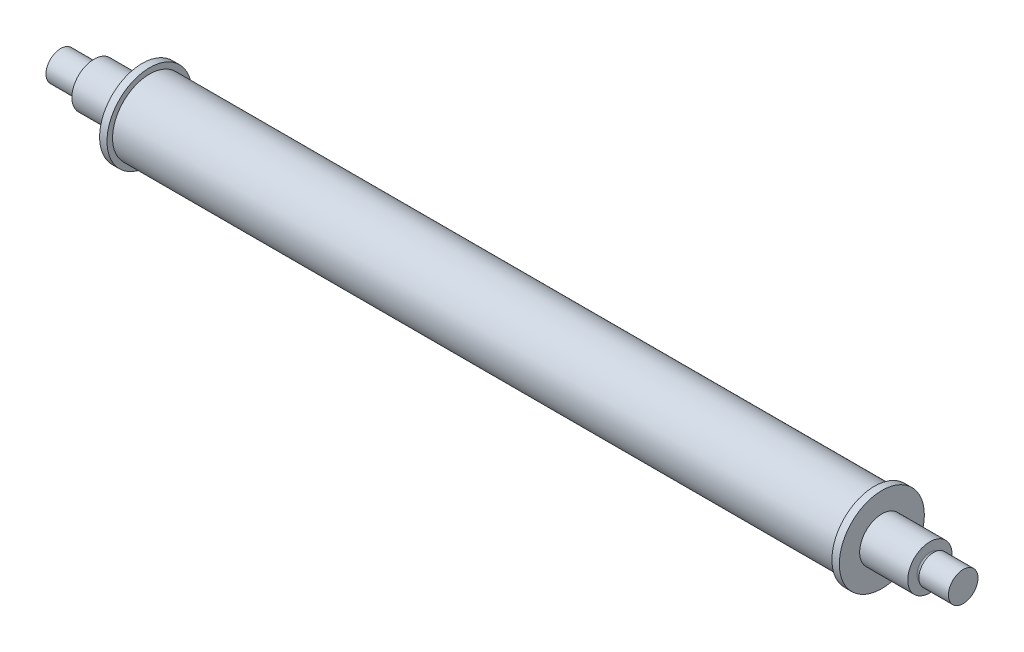
ISO-10303-21;
HEADER;
FILE_DESCRIPTION(('STEP AP214'),'2;1');
FILE_NAME('part.step','',(''),(''),'','','');
FILE_SCHEMA(('AUTOMOTIVE_DESIGN { 1 0 10303 214 1 1 1 1 }'));
ENDSEC;
DATA;
#1=APPLICATION_CONTEXT('core data for automotive mechanical design processes');
#2=APPLICATION_PROTOCOL_DEFINITION('international standard','automotive_design',2000,#1);
#3=PRODUCT_CONTEXT('',#1,'mechanical');
#4=PRODUCT('Part','Part','',(#3));
#5=PRODUCT_RELATED_PRODUCT_CATEGORY('part','',(#4));
#6=PRODUCT_DEFINITION_FORMATION('','',#4);
#7=PRODUCT_DEFINITION_CONTEXT('part definition',#1,'design');
#8=PRODUCT_DEFINITION('design','',#6,#7);
#9=PRODUCT_DEFINITION_SHAPE('','',#8);
#10=(LENGTH_UNIT() NAMED_UNIT(*) SI_UNIT(.MILLI.,.METRE.));
#11=(NAMED_UNIT(*) PLANE_ANGLE_UNIT() SI_UNIT($,.RADIAN.));
#12=(NAMED_UNIT(*) SI_UNIT($,.STERADIAN.) SOLID_ANGLE_UNIT());
#13=UNCERTAINTY_MEASURE_WITH_UNIT(LENGTH_MEASURE(1.E-05),#10,'distance_accuracy_value','');
#14=(GEOMETRIC_REPRESENTATION_CONTEXT(3) GLOBAL_UNCERTAINTY_ASSIGNED_CONTEXT((#13)) GLOBAL_UNIT_ASSIGNED_CONTEXT((#10,
#11,#12)) REPRESENTATION_CONTEXT('',''));
#15=CARTESIAN_POINT('',(0.,0.,0.));
#16=DIRECTION('',(0.,0.,1.));
#17=DIRECTION('',(1.,0.,0.));
#18=AXIS2_PLACEMENT_3D('',#15,#16,#17);
#19=CARTESIAN_POINT('',(-75.0769230769231,0.,0.));
#20=DIRECTION('',(1.,0.,0.));
#21=DIRECTION('',(0.,0.,-1.));
#22=AXIS2_PLACEMENT_3D('',#19,#20,#21);
#23=CYLINDRICAL_SURFACE('',#22,2.46153846153846);
#24=CARTESIAN_POINT('',(-75.0769230769231,0.,0.));
#25=DIRECTION('',(1.,0.,0.));
#26=DIRECTION('',(0.,0.,-1.));
#27=AXIS2_PLACEMENT_3D('',#24,#25,#26);
#28=CIRCLE('',#27,2.46153846153846);
#29=CARTESIAN_POINT('',(-75.0769230769231,0.,-2.46153846153846));
#30=VERTEX_POINT('',#29);
#31=EDGE_CURVE('E93',#30,#30,#28,.T.);
#32=ORIENTED_EDGE('',*,*,#31,.T.);
#33=EDGE_LOOP('',(#32));
#34=FACE_BOUND('',#33,.T.);
#35=CARTESIAN_POINT('',(-70.1538461538462,0.,0.));
#36=DIRECTION('',(1.,0.,0.));
#37=DIRECTION('',(0.,0.,-1.));
#38=AXIS2_PLACEMENT_3D('',#35,#36,#37);
#39=CIRCLE('',#38,2.46153846153846);
#40=CARTESIAN_POINT('',(-70.1538461538462,0.,-2.46153846153846));
#41=VERTEX_POINT('',#40);
#42=EDGE_CURVE('E10',#41,#41,#39,.T.);
#43=ORIENTED_EDGE('',*,*,#42,.F.);
#44=EDGE_LOOP('',(#43));
#45=FACE_BOUND('',#44,.T.);
#46=ADVANCED_FACE('F35',(#34,#45),#23,.T.);
#47=CARTESIAN_POINT('',(-70.1538461538462,2.15384615384615,0.));
#48=DIRECTION('',(1.,0.,0.));
#49=DIRECTION('',(0.,0.,-1.));
#50=AXIS2_PLACEMENT_3D('',#47,#48,#49);
#51=PLANE('',#50);
#52=ORIENTED_EDGE('',*,*,#42,.T.);
#53=EDGE_LOOP('',(#52));
#54=FACE_BOUND('',#53,.T.);
#55=CARTESIAN_POINT('',(-70.1538461538462,0.,0.));
#56=DIRECTION('',(1.,0.,0.));
#57=DIRECTION('',(0.,0.,-1.));
#58=AXIS2_PLACEMENT_3D('',#55,#56,#57);
#59=CIRCLE('',#58,2.15384615384615);
#60=CARTESIAN_POINT('',(-70.1538461538462,0.,-2.15384615384615));
#61=VERTEX_POINT('',#60);
#62=EDGE_CURVE('E41',#61,#61,#59,.T.);
#63=ORIENTED_EDGE('',*,*,#62,.F.);
#64=EDGE_LOOP('',(#63));
#65=FACE_BOUND('',#64,.T.);
#66=ADVANCED_FACE('F110',(#54,#65),#51,.T.);
#67=CARTESIAN_POINT('',(-69.8461538461539,0.,0.));
#68=DIRECTION('',(1.,0.,0.));
#69=DIRECTION('',(0.,0.,-1.));
#70=AXIS2_PLACEMENT_3D('',#67,#68,#69);
#71=TOROIDAL_SURFACE('',#70,2.15384615384615,0.307692307692307);
#72=ORIENTED_EDGE('',*,*,#62,.T.);
#73=EDGE_LOOP('',(#72));
#74=FACE_BOUND('',#73,.T.);
#75=CARTESIAN_POINT('',(-69.5384615384616,0.,0.));
#76=DIRECTION('',(1.,0.,0.));
#77=DIRECTION('',(0.,0.,-1.));
#78=AXIS2_PLACEMENT_3D('',#75,#76,#77);
#79=CIRCLE('',#78,2.15384615384615);
#80=CARTESIAN_POINT('',(-69.5384615384616,0.,-2.15384615384615));
#81=VERTEX_POINT('',#80);
#82=EDGE_CURVE('E45',#81,#81,#79,.T.);
#83=ORIENTED_EDGE('',*,*,#82,.F.);
#84=EDGE_LOOP('',(#83));
#85=FACE_BOUND('',#84,.T.);
#86=ADVANCED_FACE('F114',(#74,#85),#71,.F.);
#87=CARTESIAN_POINT('',(-69.5384615384616,3.69230769230769,0.));
#88=DIRECTION('',(-1.,0.,0.));
#89=DIRECTION('',(0.,0.,1.));
#90=AXIS2_PLACEMENT_3D('',#87,#88,#89);
#91=PLANE('',#90);
#92=ORIENTED_EDGE('',*,*,#82,.T.);
#93=EDGE_LOOP('',(#92));
#94=FACE_BOUND('',#93,.T.);
#95=CARTESIAN_POINT('',(-69.5384615384616,0.,0.));
#96=DIRECTION('',(1.,0.,0.));
#97=DIRECTION('',(0.,0.,-1.));
#98=AXIS2_PLACEMENT_3D('',#95,#96,#97);
#99=CIRCLE('',#98,3.69230769230769);
#100=CARTESIAN_POINT('',(-69.5384615384616,0.,-3.69230769230769));
#101=VERTEX_POINT('',#100);
#102=EDGE_CURVE('E49',#101,#101,#99,.T.);
#103=ORIENTED_EDGE('',*,*,#102,.F.);
#104=EDGE_LOOP('',(#103));
#105=FACE_BOUND('',#104,.T.);
#106=ADVANCED_FACE('F118',(#94,#105),#91,.T.);
#107=CARTESIAN_POINT('',(-75.0769230769231,0.,0.));
#108=DIRECTION('',(1.,0.,0.));
#109=DIRECTION('',(0.,0.,-1.));
#110=AXIS2_PLACEMENT_3D('',#107,#108,#109);
#111=CYLINDRICAL_SURFACE('',#110,3.69230769230769);
#112=ORIENTED_EDGE('',*,*,#102,.T.);
#113=EDGE_LOOP('',(#112));
#114=FACE_BOUND('',#113,.T.);
#115=CARTESIAN_POINT('',(-61.5384615384616,0.,0.));
#116=DIRECTION('',(1.,0.,0.));
#117=DIRECTION('',(0.,0.,-1.));
#118=AXIS2_PLACEMENT_3D('',#115,#116,#117);
#119=CIRCLE('',#118,3.69230769230769);
#120=CARTESIAN_POINT('',(-61.5384615384616,0.,-3.69230769230769));
#121=VERTEX_POINT('',#120);
#122=EDGE_CURVE('E54',#121,#121,#119,.T.);
#123=ORIENTED_EDGE('',*,*,#122,.F.);
#124=EDGE_LOOP('',(#123));
#125=FACE_BOUND('',#124,.T.);
#126=ADVANCED_FACE('F124',(#114,#125),#111,.T.);
#127=CARTESIAN_POINT('',(-61.5384615384616,7.07692307692308,0.));
#128=DIRECTION('',(-1.,0.,0.));
#129=DIRECTION('',(0.,0.,1.));
#130=AXIS2_PLACEMENT_3D('',#127,#128,#129);
#131=PLANE('',#130);
#132=ORIENTED_EDGE('',*,*,#122,.T.);
#133=EDGE_LOOP('',(#132));
#134=FACE_BOUND('',#133,.T.);
#135=CARTESIAN_POINT('',(-61.5384615384616,0.,0.));
#136=DIRECTION('',(1.,0.,0.));
#137=DIRECTION('',(0.,0.,-1.));
#138=AXIS2_PLACEMENT_3D('',#135,#136,#137);
#139=CIRCLE('',#138,7.07692307692308);
#140=CARTESIAN_POINT('',(-61.5384615384616,0.,-7.07692307692308));
#141=VERTEX_POINT('',#140);
#142=EDGE_CURVE('E57',#141,#141,#139,.T.);
#143=ORIENTED_EDGE('',*,*,#142,.F.);
#144=EDGE_LOOP('',(#143));
#145=FACE_BOUND('',#144,.T.);
#146=ADVANCED_FACE('F128',(#134,#145),#131,.T.);
#147=CARTESIAN_POINT('',(-75.0769230769231,0.,0.));
#148=DIRECTION('',(1.,0.,0.));
#149=DIRECTION('',(0.,0.,-1.));
#150=AXIS2_PLACEMENT_3D('',#147,#148,#149);
#151=CYLINDRICAL_SURFACE('',#150,7.07692307692308);
#152=ORIENTED_EDGE('',*,*,#142,.T.);
#153=EDGE_LOOP('',(#152));
#154=FACE_BOUND('',#153,.T.);
#155=CARTESIAN_POINT('',(-60.3076923076923,0.,0.));
#156=DIRECTION('',(1.,0.,0.));
#157=DIRECTION('',(0.,0.,-1.));
#158=AXIS2_PLACEMENT_3D('',#155,#156,#157);
#159=CIRCLE('',#158,7.07692307692308);
#160=CARTESIAN_POINT('',(-60.3076923076923,0.,-7.07692307692308));
#161=VERTEX_POINT('',#160);
#162=EDGE_CURVE('E60',#161,#161,#159,.T.);
#163=ORIENTED_EDGE('',*,*,#162,.F.);
#164=EDGE_LOOP('',(#163));
#165=FACE_BOUND('',#164,.T.);
#166=ADVANCED_FACE('F132',(#154,#165),#151,.T.);
#167=CARTESIAN_POINT('',(-60.3076923076923,6.15384615384616,0.));
#168=DIRECTION('',(1.,0.,0.));
#169=DIRECTION('',(0.,0.,-1.));
#170=AXIS2_PLACEMENT_3D('',#167,#168,#169);
#171=PLANE('',#170);
#172=ORIENTED_EDGE('',*,*,#162,.T.);
#173=EDGE_LOOP('',(#172));
#174=FACE_BOUND('',#173,.T.);
#175=CARTESIAN_POINT('',(-60.3076923076923,0.,0.));
#176=DIRECTION('',(1.,0.,0.));
#177=DIRECTION('',(0.,0.,-1.));
#178=AXIS2_PLACEMENT_3D('',#175,#176,#177);
#179=CIRCLE('',#178,6.15384615384616);
#180=CARTESIAN_POINT('',(-60.3076923076923,0.,-6.15384615384616));
#181=VERTEX_POINT('',#180);
#182=EDGE_CURVE('E63',#181,#181,#179,.T.);
#183=ORIENTED_EDGE('',*,*,#182,.F.);
#184=EDGE_LOOP('',(#183));
#185=FACE_BOUND('',#184,.T.);
#186=ADVANCED_FACE('F136',(#174,#185),#171,.T.);
#187=CARTESIAN_POINT('',(-75.0769230769231,0.,0.));
#188=DIRECTION('',(1.,0.,0.));
#189=DIRECTION('',(0.,0.,-1.));
#190=AXIS2_PLACEMENT_3D('',#187,#188,#189);
#191=CYLINDRICAL_SURFACE('',#190,6.15384615384616);
#192=ORIENTED_EDGE('',*,*,#182,.T.);
#193=EDGE_LOOP('',(#192));
#194=FACE_BOUND('',#193,.T.);
#195=CARTESIAN_POINT('',(60.3076923076923,0.,0.));
#196=DIRECTION('',(1.,0.,0.));
#197=DIRECTION('',(0.,0.,-1.));
#198=AXIS2_PLACEMENT_3D('',#195,#196,#197);
#199=CIRCLE('',#198,6.15384615384616);
#200=CARTESIAN_POINT('',(60.3076923076923,0.,-6.15384615384616));
#201=VERTEX_POINT('',#200);
#202=EDGE_CURVE('E66',#201,#201,#199,.T.);
#203=ORIENTED_EDGE('',*,*,#202,.F.);
#204=EDGE_LOOP('',(#203));
#205=FACE_BOUND('',#204,.T.);
#206=ADVANCED_FACE('F140',(#194,#205),#191,.T.);
#207=CARTESIAN_POINT('',(60.3076923076923,7.07692307692308,0.));
#208=DIRECTION('',(-1.,0.,0.));
#209=DIRECTION('',(0.,0.,1.));
#210=AXIS2_PLACEMENT_3D('',#207,#208,#209);
#211=PLANE('',#210);
#212=ORIENTED_EDGE('',*,*,#202,.T.);
#213=EDGE_LOOP('',(#212));
#214=FACE_BOUND('',#213,.T.);
#215=CARTESIAN_POINT('',(60.3076923076923,0.,0.));
#216=DIRECTION('',(1.,0.,0.));
#217=DIRECTION('',(0.,0.,-1.));
#218=AXIS2_PLACEMENT_3D('',#215,#216,#217);
#219=CIRCLE('',#218,7.07692307692308);
#220=CARTESIAN_POINT('',(60.3076923076923,0.,-7.07692307692308));
#221=VERTEX_POINT('',#220);
#222=EDGE_CURVE('E69',#221,#221,#219,.T.);
#223=ORIENTED_EDGE('',*,*,#222,.F.);
#224=EDGE_LOOP('',(#223));
#225=FACE_BOUND('',#224,.T.);
#226=ADVANCED_FACE('F144',(#214,#225),#211,.T.);
#227=CARTESIAN_POINT('',(-75.0769230769231,0.,0.));
#228=DIRECTION('',(1.,0.,0.));
#229=DIRECTION('',(0.,0.,-1.));
#230=AXIS2_PLACEMENT_3D('',#227,#228,#229);
#231=CYLINDRICAL_SURFACE('',#230,7.07692307692308);
#232=ORIENTED_EDGE('',*,*,#222,.T.);
#233=EDGE_LOOP('',(#232));
#234=FACE_BOUND('',#233,.T.);
#235=CARTESIAN_POINT('',(61.5384615384615,0.,0.));
#236=DIRECTION('',(1.,0.,0.));
#237=DIRECTION('',(0.,0.,-1.));
#238=AXIS2_PLACEMENT_3D('',#235,#236,#237);
#239=CIRCLE('',#238,7.07692307692308);
#240=CARTESIAN_POINT('',(61.5384615384615,0.,-7.07692307692308));
#241=VERTEX_POINT('',#240);
#242=EDGE_CURVE('E72',#241,#241,#239,.T.);
#243=ORIENTED_EDGE('',*,*,#242,.F.);
#244=EDGE_LOOP('',(#243));
#245=FACE_BOUND('',#244,.T.);
#246=ADVANCED_FACE('F148',(#234,#245),#231,.T.);
#247=CARTESIAN_POINT('',(61.5384615384616,3.69230769230769,0.));
#248=DIRECTION('',(1.,0.,0.));
#249=DIRECTION('',(0.,0.,-1.));
#250=AXIS2_PLACEMENT_3D('',#247,#248,#249);
#251=PLANE('',#250);
#252=ORIENTED_EDGE('',*,*,#242,.T.);
#253=EDGE_LOOP('',(#252));
#254=FACE_BOUND('',#253,.T.);
#255=CARTESIAN_POINT('',(61.5384615384615,0.,0.));
#256=DIRECTION('',(1.,0.,0.));
#257=DIRECTION('',(0.,0.,-1.));
#258=AXIS2_PLACEMENT_3D('',#255,#256,#257);
#259=CIRCLE('',#258,3.69230769230769);
#260=CARTESIAN_POINT('',(61.5384615384615,0.,-3.69230769230769));
#261=VERTEX_POINT('',#260);
#262=EDGE_CURVE('E75',#261,#261,#259,.T.);
#263=ORIENTED_EDGE('',*,*,#262,.F.);
#264=EDGE_LOOP('',(#263));
#265=FACE_BOUND('',#264,.T.);
#266=ADVANCED_FACE('F152',(#254,#265),#251,.T.);
#267=CARTESIAN_POINT('',(-75.0769230769231,0.,0.));
#268=DIRECTION('',(1.,0.,0.));
#269=DIRECTION('',(0.,0.,-1.));
#270=AXIS2_PLACEMENT_3D('',#267,#268,#269);
#271=CYLINDRICAL_SURFACE('',#270,3.69230769230769);
#272=ORIENTED_EDGE('',*,*,#262,.T.);
#273=EDGE_LOOP('',(#272));
#274=FACE_BOUND('',#273,.T.);
#275=CARTESIAN_POINT('',(69.5384615384615,0.,0.));
#276=DIRECTION('',(1.,0.,0.));
#277=DIRECTION('',(0.,0.,-1.));
#278=AXIS2_PLACEMENT_3D('',#275,#276,#277);
#279=CIRCLE('',#278,3.69230769230769);
#280=CARTESIAN_POINT('',(69.5384615384615,0.,-3.69230769230769));
#281=VERTEX_POINT('',#280);
#282=EDGE_CURVE('E78',#281,#281,#279,.T.);
#283=ORIENTED_EDGE('',*,*,#282,.F.);
#284=EDGE_LOOP('',(#283));
#285=FACE_BOUND('',#284,.T.);
#286=ADVANCED_FACE('F156',(#274,#285),#271,.T.);
#287=CARTESIAN_POINT('',(69.5384615384615,2.15384615384615,0.));
#288=DIRECTION('',(1.,0.,0.));
#289=DIRECTION('',(0.,0.,-1.));
#290=AXIS2_PLACEMENT_3D('',#287,#288,#289);
#291=PLANE('',#290);
#292=ORIENTED_EDGE('',*,*,#282,.T.);
#293=EDGE_LOOP('',(#292));
#294=FACE_BOUND('',#293,.T.);
#295=CARTESIAN_POINT('',(69.5384615384615,0.,0.));
#296=DIRECTION('',(1.,0.,0.));
#297=DIRECTION('',(0.,0.,-1.));
#298=AXIS2_PLACEMENT_3D('',#295,#296,#297);
#299=CIRCLE('',#298,2.15384615384615);
#300=CARTESIAN_POINT('',(69.5384615384615,0.,-2.15384615384615));
#301=VERTEX_POINT('',#300);
#302=EDGE_CURVE('E81',#301,#301,#299,.T.);
#303=ORIENTED_EDGE('',*,*,#302,.F.);
#304=EDGE_LOOP('',(#303));
#305=FACE_BOUND('',#304,.T.);
#306=ADVANCED_FACE('F160',(#294,#305),#291,.T.);
#307=CARTESIAN_POINT('',(69.8461538461539,0.,0.));
#308=DIRECTION('',(1.,0.,0.));
#309=DIRECTION('',(0.,0.,-1.));
#310=AXIS2_PLACEMENT_3D('',#307,#308,#309);
#311=TOROIDAL_SURFACE('',#310,2.15384615384615,0.307692307692307);
#312=ORIENTED_EDGE('',*,*,#302,.T.);
#313=EDGE_LOOP('',(#312));
#314=FACE_BOUND('',#313,.T.);
#315=CARTESIAN_POINT('',(70.1538461538462,0.,0.));
#316=DIRECTION('',(1.,0.,0.));
#317=DIRECTION('',(0.,0.,-1.));
#318=AXIS2_PLACEMENT_3D('',#315,#316,#317);
#319=CIRCLE('',#318,2.15384615384615);
#320=CARTESIAN_POINT('',(70.1538461538462,0.,-2.15384615384615));
#321=VERTEX_POINT('',#320);
#322=EDGE_CURVE('E84',#321,#321,#319,.T.);
#323=ORIENTED_EDGE('',*,*,#322,.F.);
#324=EDGE_LOOP('',(#323));
#325=FACE_BOUND('',#324,.T.);
#326=ADVANCED_FACE('F164',(#314,#325),#311,.F.);
#327=CARTESIAN_POINT('',(70.1538461538462,2.46153846153846,0.));
#328=DIRECTION('',(-1.,0.,0.));
#329=DIRECTION('',(0.,0.,1.));
#330=AXIS2_PLACEMENT_3D('',#327,#328,#329);
#331=PLANE('',#330);
#332=ORIENTED_EDGE('',*,*,#322,.T.);
#333=EDGE_LOOP('',(#332));
#334=FACE_BOUND('',#333,.T.);
#335=CARTESIAN_POINT('',(70.1538461538462,0.,0.));
#336=DIRECTION('',(1.,0.,0.));
#337=DIRECTION('',(0.,0.,-1.));
#338=AXIS2_PLACEMENT_3D('',#335,#336,#337);
#339=CIRCLE('',#338,2.46153846153846);
#340=CARTESIAN_POINT('',(70.1538461538462,0.,-2.46153846153846));
#341=VERTEX_POINT('',#340);
#342=EDGE_CURVE('E87',#341,#341,#339,.T.);
#343=ORIENTED_EDGE('',*,*,#342,.F.);
#344=EDGE_LOOP('',(#343));
#345=FACE_BOUND('',#344,.T.);
#346=ADVANCED_FACE('F168',(#334,#345),#331,.T.);
#347=CARTESIAN_POINT('',(-75.0769230769231,0.,0.));
#348=DIRECTION('',(1.,0.,0.));
#349=DIRECTION('',(0.,0.,-1.));
#350=AXIS2_PLACEMENT_3D('',#347,#348,#349);
#351=CYLINDRICAL_SURFACE('',#350,2.46153846153846);
#352=ORIENTED_EDGE('',*,*,#342,.T.);
#353=EDGE_LOOP('',(#352));
#354=FACE_BOUND('',#353,.T.);
#355=CARTESIAN_POINT('',(75.0769230769231,0.,0.));
#356=DIRECTION('',(1.,0.,0.));
#357=DIRECTION('',(0.,0.,-1.));
#358=AXIS2_PLACEMENT_3D('',#355,#356,#357);
#359=CIRCLE('',#358,2.46153846153846);
#360=CARTESIAN_POINT('',(75.0769230769231,0.,-2.46153846153846));
#361=VERTEX_POINT('',#360);
#362=EDGE_CURVE('E90',#361,#361,#359,.T.);
#363=ORIENTED_EDGE('',*,*,#362,.F.);
#364=EDGE_LOOP('',(#363));
#365=FACE_BOUND('',#364,.T.);
#366=ADVANCED_FACE('F106',(#354,#365),#351,.T.);
#367=CARTESIAN_POINT('',(75.0769230769231,0.,0.));
#368=DIRECTION('',(1.,0.,0.));
#369=DIRECTION('',(0.,0.,-1.));
#370=AXIS2_PLACEMENT_3D('',#367,#368,#369);
#371=PLANE('',#370);
#372=ORIENTED_EDGE('',*,*,#362,.T.);
#373=EDGE_LOOP('',(#372));
#374=FACE_BOUND('',#373,.T.);
#375=ADVANCED_FACE('F101',(#374),#371,.T.);
#376=CARTESIAN_POINT('',(-75.0769230769231,2.46153846153846,0.));
#377=DIRECTION('',(-1.,0.,0.));
#378=DIRECTION('',(0.,0.,1.));
#379=AXIS2_PLACEMENT_3D('',#376,#377,#378);
#380=PLANE('',#379);
#381=ORIENTED_EDGE('',*,*,#31,.F.);
#382=EDGE_LOOP('',(#381));
#383=FACE_BOUND('',#382,.T.);
#384=ADVANCED_FACE('F99',(#383),#380,.T.);
#385=CLOSED_SHELL('',(#46,#66,#86,#106,#126,#146,#166,#186,#206,#226,#246,#266,#286,#306,#326,
#346,#366,#375,#384));
#386=MANIFOLD_SOLID_BREP('B2',#385);
#387=ADVANCED_BREP_SHAPE_REPRESENTATION('',(#18,#386),#14);
#388=SHAPE_DEFINITION_REPRESENTATION(#9,#387);
ENDSEC;
END-ISO-10303-21;
